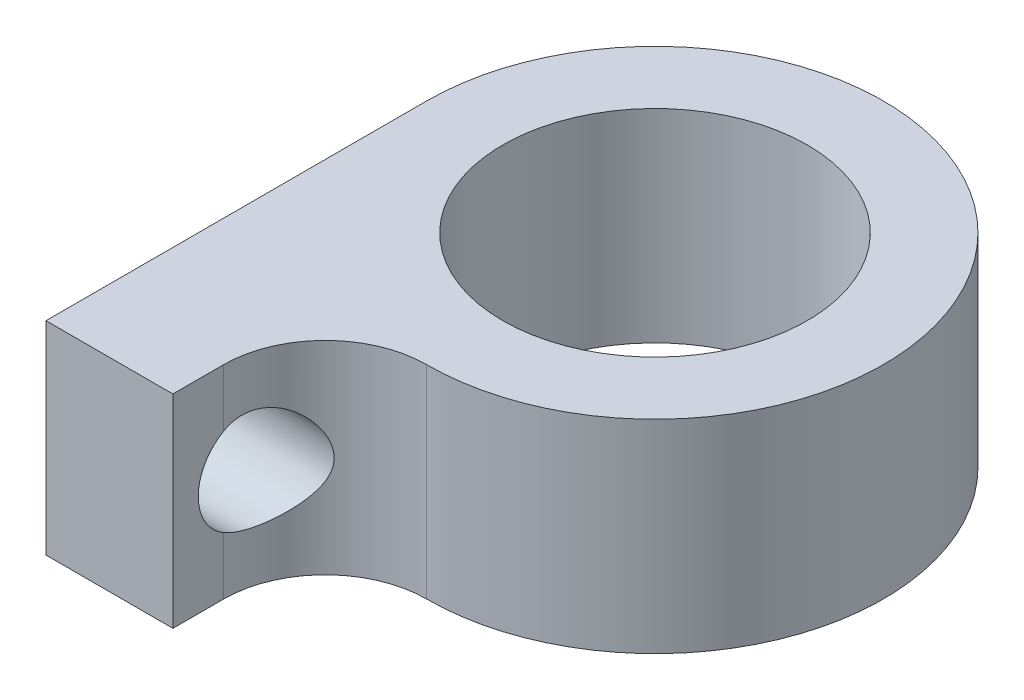
ISO-10303-21;
HEADER;
FILE_DESCRIPTION(('STEP AP214'),'2;1');
FILE_NAME('part.step','',(''),(''),'','','');
FILE_SCHEMA(('AUTOMOTIVE_DESIGN { 1 0 10303 214 1 1 1 1 }'));
ENDSEC;
DATA;
#1=APPLICATION_CONTEXT('core data for automotive mechanical design processes');
#2=APPLICATION_PROTOCOL_DEFINITION('international standard','automotive_design',2000,#1);
#3=PRODUCT_CONTEXT('',#1,'mechanical');
#4=PRODUCT('Part','Part','',(#3));
#5=PRODUCT_RELATED_PRODUCT_CATEGORY('part','',(#4));
#6=PRODUCT_DEFINITION_FORMATION('','',#4);
#7=PRODUCT_DEFINITION_CONTEXT('part definition',#1,'design');
#8=PRODUCT_DEFINITION('design','',#6,#7);
#9=PRODUCT_DEFINITION_SHAPE('','',#8);
#10=(LENGTH_UNIT() NAMED_UNIT(*) SI_UNIT(.MILLI.,.METRE.));
#11=(NAMED_UNIT(*) PLANE_ANGLE_UNIT() SI_UNIT($,.RADIAN.));
#12=(NAMED_UNIT(*) SI_UNIT($,.STERADIAN.) SOLID_ANGLE_UNIT());
#13=UNCERTAINTY_MEASURE_WITH_UNIT(LENGTH_MEASURE(1.E-05),#10,'distance_accuracy_value','');
#14=(GEOMETRIC_REPRESENTATION_CONTEXT(3) GLOBAL_UNCERTAINTY_ASSIGNED_CONTEXT((#13)) GLOBAL_UNIT_ASSIGNED_CONTEXT((#10,
#11,#12)) REPRESENTATION_CONTEXT('',''));
#15=CARTESIAN_POINT('',(0.,0.,0.));
#16=DIRECTION('',(0.,0.,1.));
#17=DIRECTION('',(1.,0.,0.));
#18=AXIS2_PLACEMENT_3D('',#15,#16,#17);
#19=CARTESIAN_POINT('',(0.,8.,0.));
#20=DIRECTION('',(0.,1.,0.));
#21=DIRECTION('',(0.,0.,1.));
#22=AXIS2_PLACEMENT_3D('',#19,#20,#21);
#23=PLANE('',#22);
#24=CARTESIAN_POINT('',(0.,8.,0.));
#25=DIRECTION('',(0.,1.,0.));
#26=DIRECTION('',(0.,0.,1.));
#27=AXIS2_PLACEMENT_3D('',#24,#25,#26);
#28=CIRCLE('',#27,9.);
#29=CARTESIAN_POINT('',(0.,8.,9.));
#30=VERTEX_POINT('',#29);
#31=CARTESIAN_POINT('',(-9.,8.,0.));
#32=VERTEX_POINT('',#31);
#33=EDGE_CURVE('E136',#30,#32,#28,.T.);
#34=ORIENTED_EDGE('',*,*,#33,.T.);
#35=DIRECTION('',(0.,0.,1.));
#36=VECTOR('',#35,1.);
#37=CARTESIAN_POINT('',(-9.,8.,0.));
#38=LINE('',#37,#36);
#39=CARTESIAN_POINT('',(-9.,8.,15.));
#40=VERTEX_POINT('',#39);
#41=EDGE_CURVE('E93',#32,#40,#38,.T.);
#42=ORIENTED_EDGE('',*,*,#41,.T.);
#43=DIRECTION('',(1.,0.,0.));
#44=VECTOR('',#43,1.);
#45=CARTESIAN_POINT('',(-9.,8.,15.));
#46=LINE('',#45,#44);
#47=CARTESIAN_POINT('',(-4.,8.,15.));
#48=VERTEX_POINT('',#47);
#49=EDGE_CURVE('E98',#40,#48,#46,.T.);
#50=ORIENTED_EDGE('',*,*,#49,.T.);
#51=DIRECTION('',(0.,0.,-1.));
#52=VECTOR('',#51,1.);
#53=CARTESIAN_POINT('',(-4.,8.,15.));
#54=LINE('',#53,#52);
#55=CARTESIAN_POINT('',(-4.,8.,13.));
#56=VERTEX_POINT('',#55);
#57=EDGE_CURVE('E102',#48,#56,#54,.T.);
#58=ORIENTED_EDGE('',*,*,#57,.T.);
#59=CARTESIAN_POINT('',(0.,8.,13.));
#60=DIRECTION('',(0.,-1.,0.));
#61=DIRECTION('',(0.,0.,1.));
#62=AXIS2_PLACEMENT_3D('',#59,#60,#61);
#63=CIRCLE('',#62,4.);
#64=EDGE_CURVE('E61',#56,#30,#63,.T.);
#65=ORIENTED_EDGE('',*,*,#64,.T.);
#66=EDGE_LOOP('',(#34,#42,#50,#58,#65));
#67=FACE_BOUND('',#66,.T.);
#68=CARTESIAN_POINT('',(0.,8.,0.));
#69=DIRECTION('',(0.,1.,0.));
#70=DIRECTION('',(0.,0.,1.));
#71=AXIS2_PLACEMENT_3D('',#68,#69,#70);
#72=CIRCLE('',#71,6.);
#73=CARTESIAN_POINT('',(0.,8.,6.));
#74=VERTEX_POINT('',#73);
#75=EDGE_CURVE('E130',#74,#74,#72,.T.);
#76=ORIENTED_EDGE('',*,*,#75,.F.);
#77=EDGE_LOOP('',(#76));
#78=FACE_BOUND('',#77,.T.);
#79=ADVANCED_FACE('F33',(#67,#78),#23,.T.);
#80=CARTESIAN_POINT('',(0.,0.,0.));
#81=DIRECTION('',(0.,1.,0.));
#82=DIRECTION('',(0.,0.,1.));
#83=AXIS2_PLACEMENT_3D('',#80,#81,#82);
#84=PLANE('',#83);
#85=CARTESIAN_POINT('',(0.,0.,0.));
#86=DIRECTION('',(0.,1.,0.));
#87=DIRECTION('',(0.,0.,1.));
#88=AXIS2_PLACEMENT_3D('',#85,#86,#87);
#89=CIRCLE('',#88,9.);
#90=CARTESIAN_POINT('',(0.,0.,9.));
#91=VERTEX_POINT('',#90);
#92=CARTESIAN_POINT('',(-9.,0.,0.));
#93=VERTEX_POINT('',#92);
#94=EDGE_CURVE('E126',#91,#93,#89,.T.);
#95=ORIENTED_EDGE('',*,*,#94,.F.);
#96=CARTESIAN_POINT('',(0.,0.,13.));
#97=DIRECTION('',(0.,-1.,0.));
#98=DIRECTION('',(0.,0.,1.));
#99=AXIS2_PLACEMENT_3D('',#96,#97,#98);
#100=CIRCLE('',#99,4.);
#101=CARTESIAN_POINT('',(-4.,0.,13.));
#102=VERTEX_POINT('',#101);
#103=EDGE_CURVE('E84',#102,#91,#100,.T.);
#104=ORIENTED_EDGE('',*,*,#103,.F.);
#105=DIRECTION('',(0.,0.,-1.));
#106=VECTOR('',#105,1.);
#107=CARTESIAN_POINT('',(-4.,0.,15.));
#108=LINE('',#107,#106);
#109=CARTESIAN_POINT('',(-4.,0.,15.));
#110=VERTEX_POINT('',#109);
#111=EDGE_CURVE('E133',#110,#102,#108,.T.);
#112=ORIENTED_EDGE('',*,*,#111,.F.);
#113=DIRECTION('',(1.,0.,0.));
#114=VECTOR('',#113,1.);
#115=CARTESIAN_POINT('',(-9.,0.,15.));
#116=LINE('',#115,#114);
#117=CARTESIAN_POINT('',(-9.,0.,15.));
#118=VERTEX_POINT('',#117);
#119=EDGE_CURVE('E111',#118,#110,#116,.T.);
#120=ORIENTED_EDGE('',*,*,#119,.F.);
#121=DIRECTION('',(0.,0.,1.));
#122=VECTOR('',#121,1.);
#123=CARTESIAN_POINT('',(-9.,0.,0.));
#124=LINE('',#123,#122);
#125=EDGE_CURVE('E129',#93,#118,#124,.T.);
#126=ORIENTED_EDGE('',*,*,#125,.F.);
#127=EDGE_LOOP('',(#95,#104,#112,#120,#126));
#128=FACE_BOUND('',#127,.T.);
#129=CARTESIAN_POINT('',(0.,0.,0.));
#130=DIRECTION('',(0.,1.,0.));
#131=DIRECTION('',(0.,0.,1.));
#132=AXIS2_PLACEMENT_3D('',#129,#130,#131);
#133=CIRCLE('',#132,6.);
#134=CARTESIAN_POINT('',(0.,0.,6.));
#135=VERTEX_POINT('',#134);
#136=EDGE_CURVE('E180',#135,#135,#133,.T.);
#137=ORIENTED_EDGE('',*,*,#136,.T.);
#138=EDGE_LOOP('',(#137));
#139=FACE_BOUND('',#138,.T.);
#140=ADVANCED_FACE('F146',(#128,#139),#84,.F.);
#141=CARTESIAN_POINT('',(0.,8.,0.));
#142=DIRECTION('',(0.,-1.,0.));
#143=DIRECTION('',(0.,0.,-1.));
#144=AXIS2_PLACEMENT_3D('',#141,#142,#143);
#145=CYLINDRICAL_SURFACE('',#144,9.);
#146=ORIENTED_EDGE('',*,*,#94,.T.);
#147=DIRECTION('',(0.,-1.,0.));
#148=VECTOR('',#147,1.);
#149=CARTESIAN_POINT('',(-9.,8.,0.));
#150=LINE('',#149,#148);
#151=EDGE_CURVE('E47',#32,#93,#150,.T.);
#152=ORIENTED_EDGE('',*,*,#151,.F.);
#153=ORIENTED_EDGE('',*,*,#33,.F.);
#154=DIRECTION('',(0.,-1.,0.));
#155=VECTOR('',#154,1.);
#156=CARTESIAN_POINT('',(0.,8.,9.));
#157=LINE('',#156,#155);
#158=EDGE_CURVE('E122',#30,#91,#157,.T.);
#159=ORIENTED_EDGE('',*,*,#158,.T.);
#160=EDGE_LOOP('',(#146,#152,#153,#159));
#161=FACE_BOUND('',#160,.T.);
#162=ADVANCED_FACE('F35',(#161),#145,.T.);
#163=CARTESIAN_POINT('',(-9.,8.,0.));
#164=DIRECTION('',(1.,0.,0.));
#165=DIRECTION('',(0.,0.,-1.));
#166=AXIS2_PLACEMENT_3D('',#163,#164,#165);
#167=PLANE('',#166);
#168=CARTESIAN_POINT('',(-9.,4.,12.));
#169=DIRECTION('',(-1.,0.,0.));
#170=DIRECTION('',(0.,0.,1.));
#171=AXIS2_PLACEMENT_3D('',#168,#169,#170);
#172=CIRCLE('',#171,2.);
#173=CARTESIAN_POINT('',(-9.,4.,14.));
#174=VERTEX_POINT('',#173);
#175=EDGE_CURVE('E178',#174,#174,#172,.T.);
#176=ORIENTED_EDGE('',*,*,#175,.F.);
#177=EDGE_LOOP('',(#176));
#178=FACE_BOUND('',#177,.T.);
#179=ORIENTED_EDGE('',*,*,#125,.T.);
#180=DIRECTION('',(0.,-1.,0.));
#181=VECTOR('',#180,1.);
#182=CARTESIAN_POINT('',(-9.,8.,15.));
#183=LINE('',#182,#181);
#184=EDGE_CURVE('E115',#40,#118,#183,.T.);
#185=ORIENTED_EDGE('',*,*,#184,.F.);
#186=ORIENTED_EDGE('',*,*,#41,.F.);
#187=ORIENTED_EDGE('',*,*,#151,.T.);
#188=EDGE_LOOP('',(#179,#185,#186,#187));
#189=FACE_BOUND('',#188,.T.);
#190=ADVANCED_FACE('F141',(#178,#189),#167,.F.);
#191=CARTESIAN_POINT('',(-9.,8.,15.));
#192=DIRECTION('',(0.,0.,-1.));
#193=DIRECTION('',(-1.,0.,0.));
#194=AXIS2_PLACEMENT_3D('',#191,#192,#193);
#195=PLANE('',#194);
#196=ORIENTED_EDGE('',*,*,#119,.T.);
#197=DIRECTION('',(0.,-1.,0.));
#198=VECTOR('',#197,1.);
#199=CARTESIAN_POINT('',(-4.,8.,15.));
#200=LINE('',#199,#198);
#201=EDGE_CURVE('E108',#48,#110,#200,.T.);
#202=ORIENTED_EDGE('',*,*,#201,.F.);
#203=ORIENTED_EDGE('',*,*,#49,.F.);
#204=ORIENTED_EDGE('',*,*,#184,.T.);
#205=EDGE_LOOP('',(#196,#202,#203,#204));
#206=FACE_BOUND('',#205,.T.);
#207=ADVANCED_FACE('F109',(#206),#195,.F.);
#208=CARTESIAN_POINT('',(-4.,8.,15.));
#209=DIRECTION('',(-1.,0.,0.));
#210=DIRECTION('',(0.,0.,1.));
#211=AXIS2_PLACEMENT_3D('',#208,#209,#210);
#212=PLANE('',#211);
#213=DIRECTION('',(0.,-1.,0.));
#214=VECTOR('',#213,1.);
#215=CARTESIAN_POINT('',(-4.,8.,13.));
#216=LINE('',#215,#214);
#217=CARTESIAN_POINT('',(-4.,2.26794919243113,13.));
#218=VERTEX_POINT('',#217);
#219=EDGE_CURVE('E138',#218,#102,#216,.T.);
#220=ORIENTED_EDGE('',*,*,#219,.F.);
#221=CARTESIAN_POINT('',(-4.,4.,12.));
#222=DIRECTION('',(-1.,0.,0.));
#223=DIRECTION('',(0.,0.,1.));
#224=AXIS2_PLACEMENT_3D('',#221,#222,#223);
#225=CIRCLE('',#224,2.);
#226=CARTESIAN_POINT('',(-4.,5.73205080756887,13.));
#227=VERTEX_POINT('',#226);
#228=EDGE_CURVE('E53',#218,#227,#225,.T.);
#229=ORIENTED_EDGE('',*,*,#228,.T.);
#230=EDGE_CURVE('E116',#56,#227,#216,.T.);
#231=ORIENTED_EDGE('',*,*,#230,.F.);
#232=ORIENTED_EDGE('',*,*,#57,.F.);
#233=ORIENTED_EDGE('',*,*,#201,.T.);
#234=ORIENTED_EDGE('',*,*,#111,.T.);
#235=EDGE_LOOP('',(#220,#229,#231,#232,#233,#234));
#236=FACE_BOUND('',#235,.T.);
#237=ADVANCED_FACE('F119',(#236),#212,.F.);
#238=CARTESIAN_POINT('',(0.,8.,13.));
#239=DIRECTION('',(0.,-1.,0.));
#240=DIRECTION('',(0.,0.,-1.));
#241=AXIS2_PLACEMENT_3D('',#238,#239,#240);
#242=CYLINDRICAL_SURFACE('',#241,4.);
#243=ORIENTED_EDGE('',*,*,#230,.T.);
#244=CARTESIAN_POINT('',(-4.,5.73205080756887,13.));
#245=CARTESIAN_POINT('',(-4.00000580966736,5.75786994741565,12.9552943110148));
#246=CARTESIAN_POINT('',(-3.99925063787569,5.7819470354746,12.909579514926));
#247=CARTESIAN_POINT('',(-3.99605748850023,5.82648023682707,12.8164716486611));
#248=CARTESIAN_POINT('',(-3.99361937017097,5.84693604709194,12.769078438433));
#249=CARTESIAN_POINT('',(-3.98690721119557,5.88404244040045,12.6730725727281));
#250=CARTESIAN_POINT('',(-3.98263743530047,5.90070172597999,12.6244629954453));
#251=CARTESIAN_POINT('',(-3.97216145839428,5.93018659468374,12.5263170330279));
#252=CARTESIAN_POINT('',(-3.96595540487123,5.94301246965673,12.4767807187538));
#253=CARTESIAN_POINT('',(-3.94429761309063,5.97567872291594,12.3272313450783));
#254=CARTESIAN_POINT('',(-3.92580804574941,5.98969713005793,12.2263054977616));
#255=CARTESIAN_POINT('',(-3.88081715113304,6.00237680782624,12.0253801620909));
#256=CARTESIAN_POINT('',(-3.85431633103587,6.00103905042552,11.9253806155073));
#257=CARTESIAN_POINT('',(-3.79376899096026,5.98391149498881,11.7279639295679));
#258=CARTESIAN_POINT('',(-3.75965355719703,5.96798529887985,11.6305801073547));
#259=CARTESIAN_POINT('',(-3.68526339721484,5.92287672377665,11.4414151855736));
#260=CARTESIAN_POINT('',(-3.64498543125918,5.89368735613911,11.3496370687285));
#261=CARTESIAN_POINT('',(-3.55474431714498,5.81938229529627,11.1626669386241));
#262=CARTESIAN_POINT('',(-3.50419922344487,5.77279723164091,11.0683429541725));
#263=CARTESIAN_POINT('',(-3.39948691355791,5.66661436067028,10.8894895869032));
#264=CARTESIAN_POINT('',(-3.34531605597378,5.60700333095459,10.8049702910663));
#265=CARTESIAN_POINT('',(-3.22665962355312,5.46510228672484,10.6332989631702));
#266=CARTESIAN_POINT('',(-3.16195701567403,5.38068927754563,10.5480471153906));
#267=CARTESIAN_POINT('',(-3.03541552649386,5.19672564242149,10.3930425671482));
#268=CARTESIAN_POINT('',(-2.97357551583598,5.09718105376927,10.3232837123918));
#269=CARTESIAN_POINT('',(-2.87549828131031,4.91379911649805,10.2187962772334));
#270=CARTESIAN_POINT('',(-2.83700117896616,4.83362976557672,10.1797571618173));
#271=CARTESIAN_POINT('',(-2.76794102739974,4.66588819403255,10.1119486185383));
#272=CARTESIAN_POINT('',(-2.73736155462676,4.57833180509106,10.0831578851529));
#273=CARTESIAN_POINT('',(-2.69266283258535,4.4142369150421,10.0419062915907));
#274=CARTESIAN_POINT('',(-2.67651630172575,4.3387832188245,10.0273779131195));
#275=CARTESIAN_POINT('',(-2.6538303017328,4.18530359867162,10.0071040821702));
#276=CARTESIAN_POINT('',(-2.64728002123666,4.10728067082318,10.0013487454791));
#277=CARTESIAN_POINT('',(-2.6446996608384,3.95073593953943,9.99907201475729));
#278=CARTESIAN_POINT('',(-2.64869390858692,3.87221340015733,10.0025719739757));
#279=CARTESIAN_POINT('',(-2.66666517774055,3.71724291580363,10.0185520644756));
#280=CARTESIAN_POINT('',(-2.68065240639705,3.64079717510625,10.0310413779594));
#281=CARTESIAN_POINT('',(-2.72139955701417,3.47310692584661,10.0682919710251));
#282=CARTESIAN_POINT('',(-2.75048013476897,3.38294742217456,10.095342416821));
#283=CARTESIAN_POINT('',(-2.81746082473272,3.21009393005886,10.160266103984));
#284=CARTESIAN_POINT('',(-2.85538156124171,3.12741803708712,10.1981647022016));
#285=CARTESIAN_POINT('',(-2.95187031481159,2.94011925109169,10.2994447723464));
#286=CARTESIAN_POINT('',(-3.012824410621,2.83901510649777,10.3670435380997));
#287=CARTESIAN_POINT('',(-3.13824957515109,2.65177643221946,10.5178524637949));
#288=CARTESIAN_POINT('',(-3.20272425109304,2.56565764968775,10.601078857197));
#289=CARTESIAN_POINT('',(-3.33170839419137,2.40777719118205,10.7835994856271));
#290=CARTESIAN_POINT('',(-3.39619824010087,2.33629690860383,10.883152267887));
#291=CARTESIAN_POINT('',(-3.5199291958013,2.21171928652819,11.0960043615849));
#292=CARTESIAN_POINT('',(-3.57917761396269,2.15859604048998,11.2092839931929));
#293=CARTESIAN_POINT('',(-3.67879074202734,2.08140148236432,11.4258297174824));
#294=CARTESIAN_POINT('',(-3.72062887845647,2.05379927202852,11.5271560064194));
#295=CARTESIAN_POINT('',(-3.79654407139163,2.01471533602872,11.7356719320954));
#296=CARTESIAN_POINT('',(-3.83062711207148,2.00322114512859,11.84285696821));
#297=CARTESIAN_POINT('',(-3.88981225558875,1.99794016759381,12.0607613218999));
#298=CARTESIAN_POINT('',(-3.91486656883541,2.00424608935868,12.1714961627298));
#299=CARTESIAN_POINT('',(-3.95512934651515,2.03566257213196,12.392131912533));
#300=CARTESIAN_POINT('',(-3.97034096443315,2.06076710471799,12.5020330774429));
#301=CARTESIAN_POINT('',(-3.98753599349099,2.11677102305881,12.6771537816987));
#302=CARTESIAN_POINT('',(-3.99232731214796,2.14213879651422,12.7439338732649));
#303=CARTESIAN_POINT('',(-3.99856524150521,2.19987597846689,12.8744431117329));
#304=CARTESIAN_POINT('',(-4.00001678373646,2.2322349862785,12.938176620782));
#305=CARTESIAN_POINT('',(-4.,2.26794919243113,13.));
#306=B_SPLINE_CURVE_WITH_KNOTS('',3,(#244,#245,#246,#247,#248,#249,#250,#251,#252,#253,#254,
#255,#256,#257,#258,#259,#260,#261,#262,#263,#264,#265,#266,#267,#268,#269,#270,#271,#272,#273,
#274,#275,#276,#277,#278,#279,#280,#281,#282,#283,#284,#285,#286,#287,#288,#289,#290,#291,#292,
#293,#294,#295,#296,#297,#298,#299,#300,#301,#302,#303,#304,#305),.UNSPECIFIED.,.F.,.F.,(4,2,2,
2,2,2,2,2,2,2,2,2,2,2,2,2,2,2,2,2,2,2,2,2,2,2,2,2,2,2,4),(0.,0.154836366739665,
0.309685684073645,0.464176397445348,0.618655345989296,0.927701064894186,1.23672722276715,
1.5486725158656,1.86078237043585,2.20960035738864,2.55877408114416,2.96602319076294,
3.37311023800587,3.66359365857785,3.95346961232876,4.18804294220031,4.42235179242956,
4.65720169698932,4.89229183072887,5.18622306114828,5.48084702698105,5.88685085321128,
6.29327877951675,6.70690730848169,7.11994969317486,7.45768630600923,7.79516141582266,
8.1343974367926,8.47352471660592,8.68786223797918,8.90188306379564),.UNSPECIFIED.);
#307=EDGE_CURVE('E11',#227,#218,#306,.T.);
#308=ORIENTED_EDGE('',*,*,#307,.T.);
#309=ORIENTED_EDGE('',*,*,#219,.T.);
#310=ORIENTED_EDGE('',*,*,#103,.T.);
#311=ORIENTED_EDGE('',*,*,#158,.F.);
#312=ORIENTED_EDGE('',*,*,#64,.F.);
#313=EDGE_LOOP('',(#243,#308,#309,#310,#311,#312));
#314=FACE_BOUND('',#313,.T.);
#315=ADVANCED_FACE('F148',(#314),#242,.F.);
#316=CARTESIAN_POINT('',(0.,8.,0.));
#317=DIRECTION('',(0.,-1.,0.));
#318=DIRECTION('',(0.,0.,-1.));
#319=AXIS2_PLACEMENT_3D('',#316,#317,#318);
#320=CYLINDRICAL_SURFACE('',#319,6.);
#321=ORIENTED_EDGE('',*,*,#75,.T.);
#322=EDGE_LOOP('',(#321));
#323=FACE_BOUND('',#322,.T.);
#324=ORIENTED_EDGE('',*,*,#136,.F.);
#325=EDGE_LOOP('',(#324));
#326=FACE_BOUND('',#325,.T.);
#327=ADVANCED_FACE('F151',(#323,#326),#320,.F.);
#328=CARTESIAN_POINT('',(1.,4.,12.));
#329=DIRECTION('',(-1.,0.,0.));
#330=DIRECTION('',(0.,0.,1.));
#331=AXIS2_PLACEMENT_3D('',#328,#329,#330);
#332=CYLINDRICAL_SURFACE('',#331,2.);
#333=ORIENTED_EDGE('',*,*,#175,.T.);
#334=EDGE_LOOP('',(#333));
#335=FACE_BOUND('',#334,.T.);
#336=ORIENTED_EDGE('',*,*,#307,.F.);
#337=ORIENTED_EDGE('',*,*,#228,.F.);
#338=EDGE_LOOP('',(#336,#337));
#339=FACE_BOUND('',#338,.T.);
#340=ADVANCED_FACE('F149',(#335,#339),#332,.F.);
#341=CLOSED_SHELL('',(#79,#140,#162,#190,#207,#237,#315,#327,#340));
#342=MANIFOLD_SOLID_BREP('B2',#341);
#343=ADVANCED_BREP_SHAPE_REPRESENTATION('',(#18,#342),#14);
#344=SHAPE_DEFINITION_REPRESENTATION(#9,#343);
ENDSEC;
END-ISO-10303-21;
